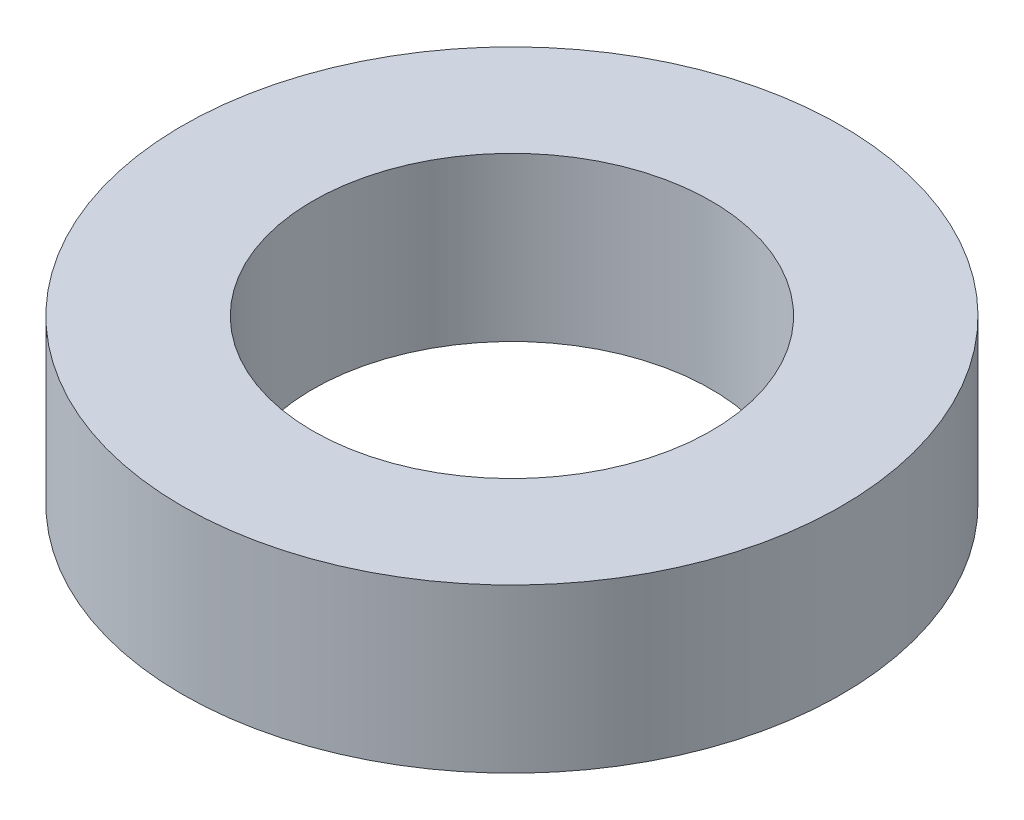
ISO-10303-21;
HEADER;
FILE_DESCRIPTION(('STEP AP214'),'2;1');
FILE_NAME('part.step','',(''),(''),'','','');
FILE_SCHEMA(('AUTOMOTIVE_DESIGN { 1 0 10303 214 1 1 1 1 }'));
ENDSEC;
DATA;
#1=APPLICATION_CONTEXT('core data for automotive mechanical design processes');
#2=APPLICATION_PROTOCOL_DEFINITION('international standard','automotive_design',2000,#1);
#3=PRODUCT_CONTEXT('',#1,'mechanical');
#4=PRODUCT('Part','Part','',(#3));
#5=PRODUCT_RELATED_PRODUCT_CATEGORY('part','',(#4));
#6=PRODUCT_DEFINITION_FORMATION('','',#4);
#7=PRODUCT_DEFINITION_CONTEXT('part definition',#1,'design');
#8=PRODUCT_DEFINITION('design','',#6,#7);
#9=PRODUCT_DEFINITION_SHAPE('','',#8);
#10=(LENGTH_UNIT() NAMED_UNIT(*) SI_UNIT(.MILLI.,.METRE.));
#11=(NAMED_UNIT(*) PLANE_ANGLE_UNIT() SI_UNIT($,.RADIAN.));
#12=(NAMED_UNIT(*) SI_UNIT($,.STERADIAN.) SOLID_ANGLE_UNIT());
#13=UNCERTAINTY_MEASURE_WITH_UNIT(LENGTH_MEASURE(1.E-05),#10,'distance_accuracy_value','');
#14=(GEOMETRIC_REPRESENTATION_CONTEXT(3) GLOBAL_UNCERTAINTY_ASSIGNED_CONTEXT((#13)) GLOBAL_UNIT_ASSIGNED_CONTEXT((#10,
#11,#12)) REPRESENTATION_CONTEXT('',''));
#15=CARTESIAN_POINT('',(0.,0.,0.));
#16=DIRECTION('',(0.,0.,1.));
#17=DIRECTION('',(1.,0.,0.));
#18=AXIS2_PLACEMENT_3D('',#15,#16,#17);
#19=CARTESIAN_POINT('',(0.,9.,0.));
#20=DIRECTION('',(0.,1.,0.));
#21=DIRECTION('',(0.,0.,1.));
#22=AXIS2_PLACEMENT_3D('',#19,#20,#21);
#23=PLANE('',#22);
#24=CARTESIAN_POINT('',(0.,9.,0.));
#25=DIRECTION('',(0.,1.,0.));
#26=DIRECTION('',(0.,0.,1.));
#27=AXIS2_PLACEMENT_3D('',#24,#25,#26);
#28=CIRCLE('',#27,18.2);
#29=CARTESIAN_POINT('',(0.,9.,18.2));
#30=VERTEX_POINT('',#29);
#31=EDGE_CURVE('E10',#30,#30,#28,.T.);
#32=ORIENTED_EDGE('',*,*,#31,.T.);
#33=EDGE_LOOP('',(#32));
#34=FACE_BOUND('',#33,.T.);
#35=CARTESIAN_POINT('',(0.,9.,0.));
#36=DIRECTION('',(0.,1.,0.));
#37=DIRECTION('',(0.,0.,1.));
#38=AXIS2_PLACEMENT_3D('',#35,#36,#37);
#39=CIRCLE('',#38,11.);
#40=CARTESIAN_POINT('',(0.,9.,11.));
#41=VERTEX_POINT('',#40);
#42=EDGE_CURVE('E41',#41,#41,#39,.T.);
#43=ORIENTED_EDGE('',*,*,#42,.F.);
#44=EDGE_LOOP('',(#43));
#45=FACE_BOUND('',#44,.T.);
#46=ADVANCED_FACE('F30',(#34,#45),#23,.T.);
#47=CARTESIAN_POINT('',(0.,0.,0.));
#48=DIRECTION('',(0.,1.,0.));
#49=DIRECTION('',(0.,0.,1.));
#50=AXIS2_PLACEMENT_3D('',#47,#48,#49);
#51=PLANE('',#50);
#52=CARTESIAN_POINT('',(0.,0.,0.));
#53=DIRECTION('',(0.,1.,0.));
#54=DIRECTION('',(0.,0.,1.));
#55=AXIS2_PLACEMENT_3D('',#52,#53,#54);
#56=CIRCLE('',#55,18.2);
#57=CARTESIAN_POINT('',(0.,0.,18.2));
#58=VERTEX_POINT('',#57);
#59=EDGE_CURVE('E34',#58,#58,#56,.T.);
#60=ORIENTED_EDGE('',*,*,#59,.F.);
#61=EDGE_LOOP('',(#60));
#62=FACE_BOUND('',#61,.T.);
#63=CARTESIAN_POINT('',(0.,0.,0.));
#64=DIRECTION('',(0.,1.,0.));
#65=DIRECTION('',(0.,0.,1.));
#66=AXIS2_PLACEMENT_3D('',#63,#64,#65);
#67=CIRCLE('',#66,11.);
#68=CARTESIAN_POINT('',(0.,0.,11.));
#69=VERTEX_POINT('',#68);
#70=EDGE_CURVE('E43',#69,#69,#67,.T.);
#71=ORIENTED_EDGE('',*,*,#70,.T.);
#72=EDGE_LOOP('',(#71));
#73=FACE_BOUND('',#72,.T.);
#74=ADVANCED_FACE('F53',(#62,#73),#51,.F.);
#75=CARTESIAN_POINT('',(0.,9.,0.));
#76=DIRECTION('',(0.,-1.,0.));
#77=DIRECTION('',(0.,0.,-1.));
#78=AXIS2_PLACEMENT_3D('',#75,#76,#77);
#79=CYLINDRICAL_SURFACE('',#78,18.2);
#80=ORIENTED_EDGE('',*,*,#31,.F.);
#81=EDGE_LOOP('',(#80));
#82=FACE_BOUND('',#81,.T.);
#83=ORIENTED_EDGE('',*,*,#59,.T.);
#84=EDGE_LOOP('',(#83));
#85=FACE_BOUND('',#84,.T.);
#86=ADVANCED_FACE('F32',(#82,#85),#79,.T.);
#87=CARTESIAN_POINT('',(0.,9.,0.));
#88=DIRECTION('',(0.,-1.,0.));
#89=DIRECTION('',(0.,0.,-1.));
#90=AXIS2_PLACEMENT_3D('',#87,#88,#89);
#91=CYLINDRICAL_SURFACE('',#90,11.);
#92=ORIENTED_EDGE('',*,*,#42,.T.);
#93=EDGE_LOOP('',(#92));
#94=FACE_BOUND('',#93,.T.);
#95=ORIENTED_EDGE('',*,*,#70,.F.);
#96=EDGE_LOOP('',(#95));
#97=FACE_BOUND('',#96,.T.);
#98=ADVANCED_FACE('F49',(#94,#97),#91,.F.);
#99=CLOSED_SHELL('',(#46,#74,#86,#98));
#100=MANIFOLD_SOLID_BREP('B2',#99);
#101=ADVANCED_BREP_SHAPE_REPRESENTATION('',(#18,#100),#14);
#102=SHAPE_DEFINITION_REPRESENTATION(#9,#101);
ENDSEC;
END-ISO-10303-21;
